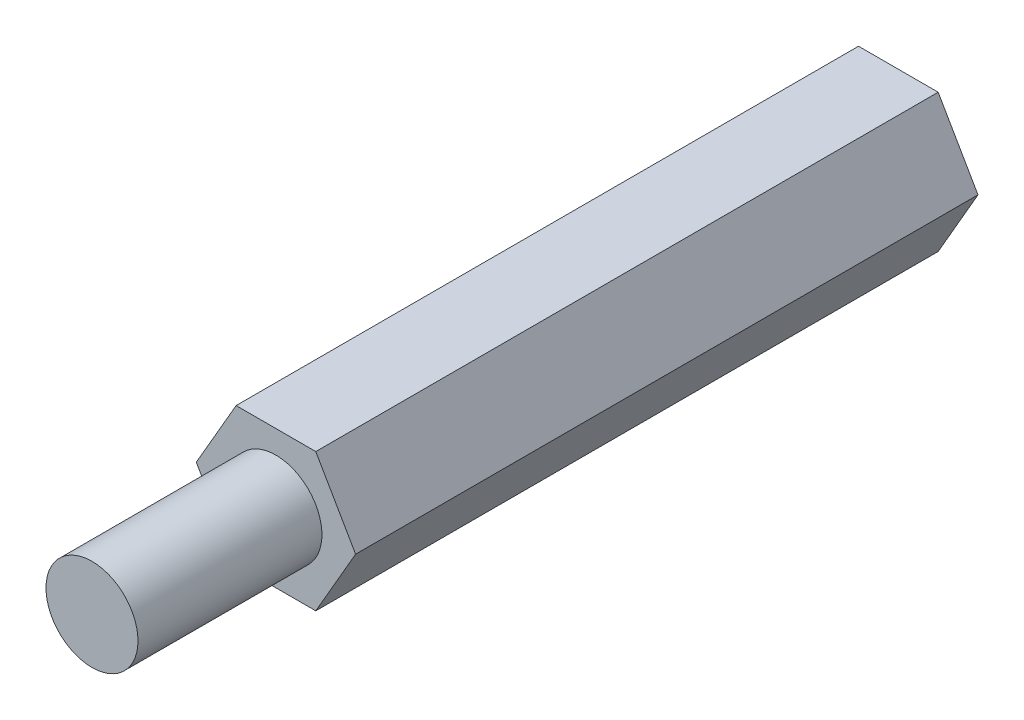
ISO-10303-21;
HEADER;
FILE_DESCRIPTION(('STEP AP214'),'2;1');
FILE_NAME('part.step','',(''),(''),'','','');
FILE_SCHEMA(('AUTOMOTIVE_DESIGN { 1 0 10303 214 1 1 1 1 }'));
ENDSEC;
DATA;
#1=APPLICATION_CONTEXT('core data for automotive mechanical design processes');
#2=APPLICATION_PROTOCOL_DEFINITION('international standard','automotive_design',2000,#1);
#3=PRODUCT_CONTEXT('',#1,'mechanical');
#4=PRODUCT('Part','Part','',(#3));
#5=PRODUCT_RELATED_PRODUCT_CATEGORY('part','',(#4));
#6=PRODUCT_DEFINITION_FORMATION('','',#4);
#7=PRODUCT_DEFINITION_CONTEXT('part definition',#1,'design');
#8=PRODUCT_DEFINITION('design','',#6,#7);
#9=PRODUCT_DEFINITION_SHAPE('','',#8);
#10=(LENGTH_UNIT() NAMED_UNIT(*) SI_UNIT(.MILLI.,.METRE.));
#11=(NAMED_UNIT(*) PLANE_ANGLE_UNIT() SI_UNIT($,.RADIAN.));
#12=(NAMED_UNIT(*) SI_UNIT($,.STERADIAN.) SOLID_ANGLE_UNIT());
#13=UNCERTAINTY_MEASURE_WITH_UNIT(LENGTH_MEASURE(1.E-05),#10,'distance_accuracy_value','');
#14=(GEOMETRIC_REPRESENTATION_CONTEXT(3) GLOBAL_UNCERTAINTY_ASSIGNED_CONTEXT((#13)) GLOBAL_UNIT_ASSIGNED_CONTEXT((#10,
#11,#12)) REPRESENTATION_CONTEXT('',''));
#15=CARTESIAN_POINT('',(0.,0.,0.));
#16=DIRECTION('',(0.,0.,1.));
#17=DIRECTION('',(1.,0.,0.));
#18=AXIS2_PLACEMENT_3D('',#15,#16,#17);
#19=CARTESIAN_POINT('',(0.,0.,6.));
#20=DIRECTION('',(0.,0.,-1.));
#21=DIRECTION('',(-1.,0.,0.));
#22=AXIS2_PLACEMENT_3D('',#19,#20,#21);
#23=CYLINDRICAL_SURFACE('',#22,1.5);
#24=CARTESIAN_POINT('',(0.,0.,6.));
#25=DIRECTION('',(0.,0.,1.));
#26=DIRECTION('',(1.,0.,0.));
#27=AXIS2_PLACEMENT_3D('',#24,#25,#26);
#28=CIRCLE('',#27,1.5);
#29=CARTESIAN_POINT('',(1.5,0.,6.));
#30=VERTEX_POINT('',#29);
#31=EDGE_CURVE('E11',#30,#30,#28,.T.);
#32=ORIENTED_EDGE('',*,*,#31,.F.);
#33=EDGE_LOOP('',(#32));
#34=FACE_BOUND('',#33,.T.);
#35=CARTESIAN_POINT('',(0.,0.,0.));
#36=DIRECTION('',(0.,0.,-1.));
#37=DIRECTION('',(-1.,0.,0.));
#38=AXIS2_PLACEMENT_3D('',#35,#36,#37);
#39=CIRCLE('',#38,1.5);
#40=CARTESIAN_POINT('',(-1.5,0.,0.));
#41=VERTEX_POINT('',#40);
#42=EDGE_CURVE('E45',#41,#41,#39,.T.);
#43=ORIENTED_EDGE('',*,*,#42,.F.);
#44=EDGE_LOOP('',(#43));
#45=FACE_BOUND('',#44,.T.);
#46=ADVANCED_FACE('F37',(#34,#45),#23,.T.);
#47=CARTESIAN_POINT('',(0.,0.,6.));
#48=DIRECTION('',(0.,0.,1.));
#49=DIRECTION('',(1.,0.,0.));
#50=AXIS2_PLACEMENT_3D('',#47,#48,#49);
#51=PLANE('',#50);
#52=ORIENTED_EDGE('',*,*,#31,.T.);
#53=EDGE_LOOP('',(#52));
#54=FACE_BOUND('',#53,.T.);
#55=ADVANCED_FACE('F147',(#54),#51,.T.);
#56=CARTESIAN_POINT('',(0.,0.,0.));
#57=DIRECTION('',(0.,0.,-1.));
#58=DIRECTION('',(-1.,0.,0.));
#59=AXIS2_PLACEMENT_3D('',#56,#57,#58);
#60=PLANE('',#59);
#61=DIRECTION('',(1.,0.,0.));
#62=VECTOR('',#61,1.);
#63=CARTESIAN_POINT('',(-1.29903810567666,2.25,0.));
#64=LINE('',#63,#62);
#65=CARTESIAN_POINT('',(-1.29903810567666,2.25,0.));
#66=VERTEX_POINT('',#65);
#67=CARTESIAN_POINT('',(1.29903810567666,2.25,0.));
#68=VERTEX_POINT('',#67);
#69=EDGE_CURVE('E122',#66,#68,#64,.T.);
#70=ORIENTED_EDGE('',*,*,#69,.F.);
#71=DIRECTION('',(0.5,0.866025403784438,0.));
#72=VECTOR('',#71,1.);
#73=CARTESIAN_POINT('',(-2.59807621135332,0.,0.));
#74=LINE('',#73,#72);
#75=CARTESIAN_POINT('',(-2.59807621135332,0.,0.));
#76=VERTEX_POINT('',#75);
#77=EDGE_CURVE('E82',#76,#66,#74,.T.);
#78=ORIENTED_EDGE('',*,*,#77,.F.);
#79=DIRECTION('',(-0.5,0.866025403784439,0.));
#80=VECTOR('',#79,1.);
#81=CARTESIAN_POINT('',(-1.29903810567666,-2.25,0.));
#82=LINE('',#81,#80);
#83=CARTESIAN_POINT('',(-1.29903810567666,-2.25,0.));
#84=VERTEX_POINT('',#83);
#85=EDGE_CURVE('E76',#84,#76,#82,.T.);
#86=ORIENTED_EDGE('',*,*,#85,.F.);
#87=DIRECTION('',(-1.,0.,0.));
#88=VECTOR('',#87,1.);
#89=CARTESIAN_POINT('',(1.29903810567666,-2.25,0.));
#90=LINE('',#89,#88);
#91=CARTESIAN_POINT('',(1.29903810567666,-2.25,0.));
#92=VERTEX_POINT('',#91);
#93=EDGE_CURVE('E112',#92,#84,#90,.T.);
#94=ORIENTED_EDGE('',*,*,#93,.F.);
#95=DIRECTION('',(-0.5,-0.866025403784438,0.));
#96=VECTOR('',#95,1.);
#97=CARTESIAN_POINT('',(2.59807621135332,0.,0.));
#98=LINE('',#97,#96);
#99=CARTESIAN_POINT('',(2.59807621135332,0.,0.));
#100=VERTEX_POINT('',#99);
#101=EDGE_CURVE('E128',#100,#92,#98,.T.);
#102=ORIENTED_EDGE('',*,*,#101,.F.);
#103=DIRECTION('',(0.5,-0.866025403784439,0.));
#104=VECTOR('',#103,1.);
#105=CARTESIAN_POINT('',(1.29903810567666,2.25,0.));
#106=LINE('',#105,#104);
#107=EDGE_CURVE('E125',#68,#100,#106,.T.);
#108=ORIENTED_EDGE('',*,*,#107,.F.);
#109=EDGE_LOOP('',(#70,#78,#86,#94,#102,#108));
#110=FACE_BOUND('',#109,.T.);
#111=ORIENTED_EDGE('',*,*,#42,.T.);
#112=EDGE_LOOP('',(#111));
#113=FACE_BOUND('',#112,.T.);
#114=ADVANCED_FACE('F144',(#110,#113),#60,.F.);
#115=CARTESIAN_POINT('',(-1.29903810567666,2.25,-20.3));
#116=DIRECTION('',(0.,-1.,0.));
#117=DIRECTION('',(0.,0.,-1.));
#118=AXIS2_PLACEMENT_3D('',#115,#116,#117);
#119=PLANE('',#118);
#120=ORIENTED_EDGE('',*,*,#69,.T.);
#121=DIRECTION('',(0.,0.,1.));
#122=VECTOR('',#121,1.);
#123=CARTESIAN_POINT('',(1.29903810567666,2.25,-20.3));
#124=LINE('',#123,#122);
#125=CARTESIAN_POINT('',(1.29903810567666,2.25,-20.3));
#126=VERTEX_POINT('',#125);
#127=EDGE_CURVE('E140',#126,#68,#124,.T.);
#128=ORIENTED_EDGE('',*,*,#127,.F.);
#129=DIRECTION('',(1.,0.,0.));
#130=VECTOR('',#129,1.);
#131=CARTESIAN_POINT('',(-1.29903810567666,2.25,-20.3));
#132=LINE('',#131,#130);
#133=CARTESIAN_POINT('',(-1.29903810567666,2.25,-20.3));
#134=VERTEX_POINT('',#133);
#135=EDGE_CURVE('E133',#134,#126,#132,.T.);
#136=ORIENTED_EDGE('',*,*,#135,.F.);
#137=DIRECTION('',(0.,0.,1.));
#138=VECTOR('',#137,1.);
#139=CARTESIAN_POINT('',(-1.29903810567666,2.25,-20.3));
#140=LINE('',#139,#138);
#141=EDGE_CURVE('E118',#134,#66,#140,.T.);
#142=ORIENTED_EDGE('',*,*,#141,.T.);
#143=EDGE_LOOP('',(#120,#128,#136,#142));
#144=FACE_BOUND('',#143,.T.);
#145=ADVANCED_FACE('F157',(#144),#119,.F.);
#146=CARTESIAN_POINT('',(1.29903810567666,2.25,-20.3));
#147=DIRECTION('',(-0.866025403784439,-0.5,0.));
#148=DIRECTION('',(0.5,-0.866025403784439,0.));
#149=AXIS2_PLACEMENT_3D('',#146,#147,#148);
#150=PLANE('',#149);
#151=ORIENTED_EDGE('',*,*,#107,.T.);
#152=DIRECTION('',(0.,0.,1.));
#153=VECTOR('',#152,1.);
#154=CARTESIAN_POINT('',(2.59807621135332,0.,-20.3));
#155=LINE('',#154,#153);
#156=CARTESIAN_POINT('',(2.59807621135332,0.,-20.3));
#157=VERTEX_POINT('',#156);
#158=EDGE_CURVE('E137',#157,#100,#155,.T.);
#159=ORIENTED_EDGE('',*,*,#158,.F.);
#160=DIRECTION('',(0.5,-0.866025403784439,0.));
#161=VECTOR('',#160,1.);
#162=CARTESIAN_POINT('',(1.29903810567666,2.25,-20.3));
#163=LINE('',#162,#161);
#164=EDGE_CURVE('E91',#126,#157,#163,.T.);
#165=ORIENTED_EDGE('',*,*,#164,.F.);
#166=ORIENTED_EDGE('',*,*,#127,.T.);
#167=EDGE_LOOP('',(#151,#159,#165,#166));
#168=FACE_BOUND('',#167,.T.);
#169=ADVANCED_FACE('F163',(#168),#150,.F.);
#170=CARTESIAN_POINT('',(2.59807621135332,0.,-20.3));
#171=DIRECTION('',(-0.866025403784438,0.5,0.));
#172=DIRECTION('',(-0.5,-0.866025403784438,0.));
#173=AXIS2_PLACEMENT_3D('',#170,#171,#172);
#174=PLANE('',#173);
#175=ORIENTED_EDGE('',*,*,#101,.T.);
#176=DIRECTION('',(0.,0.,1.));
#177=VECTOR('',#176,1.);
#178=CARTESIAN_POINT('',(1.29903810567666,-2.25,-20.3));
#179=LINE('',#178,#177);
#180=CARTESIAN_POINT('',(1.29903810567666,-2.25,-20.3));
#181=VERTEX_POINT('',#180);
#182=EDGE_CURVE('E113',#181,#92,#179,.T.);
#183=ORIENTED_EDGE('',*,*,#182,.F.);
#184=DIRECTION('',(-0.5,-0.866025403784438,0.));
#185=VECTOR('',#184,1.);
#186=CARTESIAN_POINT('',(2.59807621135332,0.,-20.3));
#187=LINE('',#186,#185);
#188=EDGE_CURVE('E104',#157,#181,#187,.T.);
#189=ORIENTED_EDGE('',*,*,#188,.F.);
#190=ORIENTED_EDGE('',*,*,#158,.T.);
#191=EDGE_LOOP('',(#175,#183,#189,#190));
#192=FACE_BOUND('',#191,.T.);
#193=ADVANCED_FACE('F167',(#192),#174,.F.);
#194=CARTESIAN_POINT('',(1.29903810567666,-2.25,-20.3));
#195=DIRECTION('',(0.,1.,0.));
#196=DIRECTION('',(-1.,0.,0.));
#197=AXIS2_PLACEMENT_3D('',#194,#195,#196);
#198=PLANE('',#197);
#199=ORIENTED_EDGE('',*,*,#93,.T.);
#200=DIRECTION('',(0.,0.,1.));
#201=VECTOR('',#200,1.);
#202=CARTESIAN_POINT('',(-1.29903810567666,-2.25,-20.3));
#203=LINE('',#202,#201);
#204=CARTESIAN_POINT('',(-1.29903810567666,-2.25,-20.3));
#205=VERTEX_POINT('',#204);
#206=EDGE_CURVE('E109',#205,#84,#203,.T.);
#207=ORIENTED_EDGE('',*,*,#206,.F.);
#208=DIRECTION('',(-1.,0.,0.));
#209=VECTOR('',#208,1.);
#210=CARTESIAN_POINT('',(1.29903810567666,-2.25,-20.3));
#211=LINE('',#210,#209);
#212=EDGE_CURVE('E98',#181,#205,#211,.T.);
#213=ORIENTED_EDGE('',*,*,#212,.F.);
#214=ORIENTED_EDGE('',*,*,#182,.T.);
#215=EDGE_LOOP('',(#199,#207,#213,#214));
#216=FACE_BOUND('',#215,.T.);
#217=ADVANCED_FACE('F110',(#216),#198,.F.);
#218=CARTESIAN_POINT('',(-1.29903810567666,-2.25,-20.3));
#219=DIRECTION('',(0.866025403784439,0.5,0.));
#220=DIRECTION('',(-0.5,0.866025403784439,0.));
#221=AXIS2_PLACEMENT_3D('',#218,#219,#220);
#222=PLANE('',#221);
#223=ORIENTED_EDGE('',*,*,#85,.T.);
#224=DIRECTION('',(0.,0.,1.));
#225=VECTOR('',#224,1.);
#226=CARTESIAN_POINT('',(-2.59807621135332,0.,-20.3));
#227=LINE('',#226,#225);
#228=CARTESIAN_POINT('',(-2.59807621135332,0.,-20.3));
#229=VERTEX_POINT('',#228);
#230=EDGE_CURVE('E114',#229,#76,#227,.T.);
#231=ORIENTED_EDGE('',*,*,#230,.F.);
#232=DIRECTION('',(-0.5,0.866025403784439,0.));
#233=VECTOR('',#232,1.);
#234=CARTESIAN_POINT('',(-1.29903810567666,-2.25,-20.3));
#235=LINE('',#234,#233);
#236=EDGE_CURVE('E102',#205,#229,#235,.T.);
#237=ORIENTED_EDGE('',*,*,#236,.F.);
#238=ORIENTED_EDGE('',*,*,#206,.T.);
#239=EDGE_LOOP('',(#223,#231,#237,#238));
#240=FACE_BOUND('',#239,.T.);
#241=ADVANCED_FACE('F116',(#240),#222,.F.);
#242=CARTESIAN_POINT('',(-2.59807621135332,0.,-20.3));
#243=DIRECTION('',(0.866025403784438,-0.5,0.));
#244=DIRECTION('',(0.5,0.866025403784439,0.));
#245=AXIS2_PLACEMENT_3D('',#242,#243,#244);
#246=PLANE('',#245);
#247=ORIENTED_EDGE('',*,*,#77,.T.);
#248=ORIENTED_EDGE('',*,*,#141,.F.);
#249=DIRECTION('',(0.5,0.866025403784438,0.));
#250=VECTOR('',#249,1.);
#251=CARTESIAN_POINT('',(-2.59807621135332,0.,-20.3));
#252=LINE('',#251,#250);
#253=EDGE_CURVE('E53',#229,#134,#252,.T.);
#254=ORIENTED_EDGE('',*,*,#253,.F.);
#255=ORIENTED_EDGE('',*,*,#230,.T.);
#256=EDGE_LOOP('',(#247,#248,#254,#255));
#257=FACE_BOUND('',#256,.T.);
#258=ADVANCED_FACE('F175',(#257),#246,.F.);
#259=CARTESIAN_POINT('',(0.,0.,-20.3));
#260=DIRECTION('',(0.,0.,-1.));
#261=DIRECTION('',(-1.,0.,0.));
#262=AXIS2_PLACEMENT_3D('',#259,#260,#261);
#263=PLANE('',#262);
#264=CARTESIAN_POINT('',(0.,0.,-20.3));
#265=DIRECTION('',(0.,0.,-1.));
#266=DIRECTION('',(-1.,0.,0.));
#267=AXIS2_PLACEMENT_3D('',#264,#265,#266);
#268=CIRCLE('',#267,1.5);
#269=CARTESIAN_POINT('',(-1.5,0.,-20.3));
#270=VERTEX_POINT('',#269);
#271=EDGE_CURVE('E192',#270,#270,#268,.T.);
#272=ORIENTED_EDGE('',*,*,#271,.F.);
#273=EDGE_LOOP('',(#272));
#274=FACE_BOUND('',#273,.T.);
#275=ORIENTED_EDGE('',*,*,#135,.T.);
#276=ORIENTED_EDGE('',*,*,#164,.T.);
#277=ORIENTED_EDGE('',*,*,#188,.T.);
#278=ORIENTED_EDGE('',*,*,#212,.T.);
#279=ORIENTED_EDGE('',*,*,#236,.T.);
#280=ORIENTED_EDGE('',*,*,#253,.T.);
#281=EDGE_LOOP('',(#275,#276,#277,#278,#279,#280));
#282=FACE_BOUND('',#281,.T.);
#283=ADVANCED_FACE('F100',(#274,#282),#263,.T.);
#284=CARTESIAN_POINT('',(0.,0.,-15.8));
#285=DIRECTION('',(0.,0.,-1.));
#286=DIRECTION('',(-1.,0.,0.));
#287=AXIS2_PLACEMENT_3D('',#284,#285,#286);
#288=CYLINDRICAL_SURFACE('',#287,1.5);
#289=CARTESIAN_POINT('',(0.,0.,-15.8));
#290=DIRECTION('',(0.,0.,-1.));
#291=DIRECTION('',(-1.,0.,0.));
#292=AXIS2_PLACEMENT_3D('',#289,#290,#291);
#293=CIRCLE('',#292,1.5);
#294=CARTESIAN_POINT('',(-1.5,0.,-15.8));
#295=VERTEX_POINT('',#294);
#296=EDGE_CURVE('E126',#295,#295,#293,.T.);
#297=ORIENTED_EDGE('',*,*,#296,.F.);
#298=EDGE_LOOP('',(#297));
#299=FACE_BOUND('',#298,.T.);
#300=ORIENTED_EDGE('',*,*,#271,.T.);
#301=EDGE_LOOP('',(#300));
#302=FACE_BOUND('',#301,.T.);
#303=ADVANCED_FACE('F180',(#299,#302),#288,.F.);
#304=CARTESIAN_POINT('',(0.,0.,-15.8));
#305=DIRECTION('',(0.,0.,-1.));
#306=DIRECTION('',(-1.,0.,0.));
#307=AXIS2_PLACEMENT_3D('',#304,#305,#306);
#308=PLANE('',#307);
#309=ORIENTED_EDGE('',*,*,#296,.T.);
#310=EDGE_LOOP('',(#309));
#311=FACE_BOUND('',#310,.T.);
#312=ADVANCED_FACE('F184',(#311),#308,.T.);
#313=CLOSED_SHELL('',(#46,#55,#114,#145,#169,#193,#217,#241,#258,#283,#303,#312));
#314=MANIFOLD_SOLID_BREP('B2',#313);
#315=ADVANCED_BREP_SHAPE_REPRESENTATION('',(#18,#314),#14);
#316=SHAPE_DEFINITION_REPRESENTATION(#9,#315);
ENDSEC;
END-ISO-10303-21;
